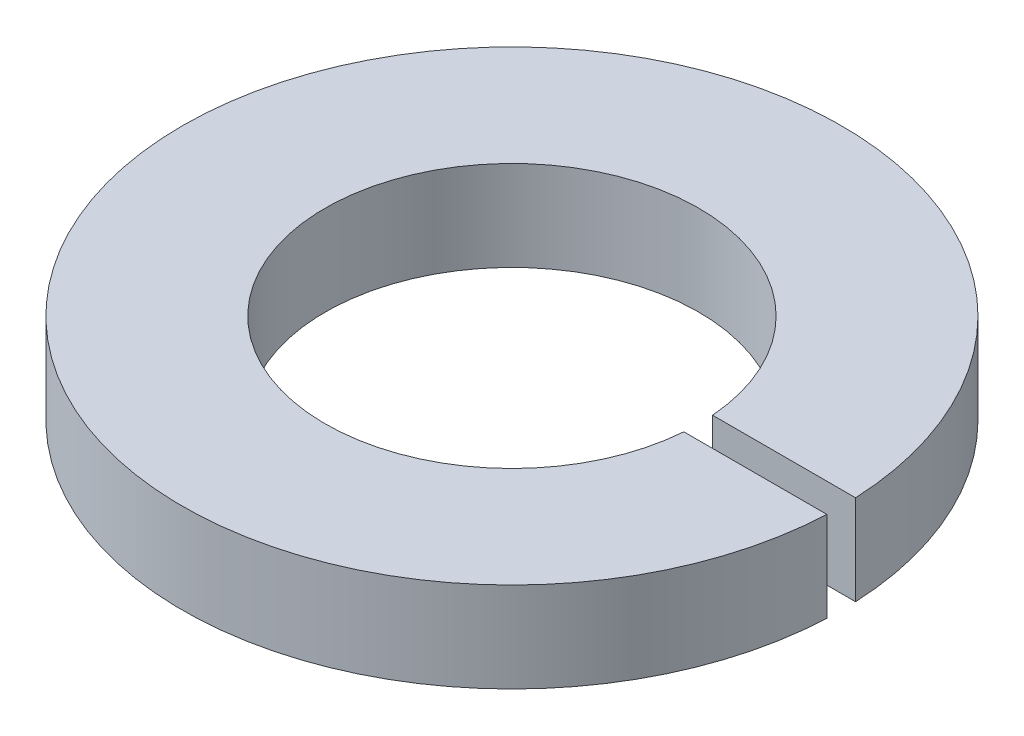
ISO-10303-21;
HEADER;
FILE_DESCRIPTION(('STEP AP214'),'2;1');
FILE_NAME('part.step','',(''),(''),'','','');
FILE_SCHEMA(('AUTOMOTIVE_DESIGN { 1 0 10303 214 1 1 1 1 }'));
ENDSEC;
DATA;
#1=APPLICATION_CONTEXT('core data for automotive mechanical design processes');
#2=APPLICATION_PROTOCOL_DEFINITION('international standard','automotive_design',2000,#1);
#3=PRODUCT_CONTEXT('',#1,'mechanical');
#4=PRODUCT('Part','Part','',(#3));
#5=PRODUCT_RELATED_PRODUCT_CATEGORY('part','',(#4));
#6=PRODUCT_DEFINITION_FORMATION('','',#4);
#7=PRODUCT_DEFINITION_CONTEXT('part definition',#1,'design');
#8=PRODUCT_DEFINITION('design','',#6,#7);
#9=PRODUCT_DEFINITION_SHAPE('','',#8);
#10=(LENGTH_UNIT() NAMED_UNIT(*) SI_UNIT(.MILLI.,.METRE.));
#11=(NAMED_UNIT(*) PLANE_ANGLE_UNIT() SI_UNIT($,.RADIAN.));
#12=(NAMED_UNIT(*) SI_UNIT($,.STERADIAN.) SOLID_ANGLE_UNIT());
#13=UNCERTAINTY_MEASURE_WITH_UNIT(LENGTH_MEASURE(1.E-05),#10,'distance_accuracy_value','');
#14=(GEOMETRIC_REPRESENTATION_CONTEXT(3) GLOBAL_UNCERTAINTY_ASSIGNED_CONTEXT((#13)) GLOBAL_UNIT_ASSIGNED_CONTEXT((#10,
#11,#12)) REPRESENTATION_CONTEXT('',''));
#15=CARTESIAN_POINT('',(0.,0.,0.));
#16=DIRECTION('',(0.,0.,1.));
#17=DIRECTION('',(1.,0.,0.));
#18=AXIS2_PLACEMENT_3D('',#15,#16,#17);
#19=CARTESIAN_POINT('',(0.,2.3876,0.));
#20=DIRECTION('',(0.,1.,0.));
#21=DIRECTION('',(0.,0.,1.));
#22=AXIS2_PLACEMENT_3D('',#19,#20,#21);
#23=PLANE('',#22);
#24=CARTESIAN_POINT('',(0.,2.3876,0.));
#25=DIRECTION('',(0.,1.,0.));
#26=DIRECTION('',(0.,0.,1.));
#27=AXIS2_PLACEMENT_3D('',#24,#25,#26);
#28=CIRCLE('',#27,8.7376);
#29=CARTESIAN_POINT('',(8.72928936168346,2.3876,-0.380999999999999));
#30=VERTEX_POINT('',#29);
#31=CARTESIAN_POINT('',(8.72928936168346,2.3876,0.381000000000001));
#32=VERTEX_POINT('',#31);
#33=EDGE_CURVE('E91',#30,#32,#28,.T.);
#34=ORIENTED_EDGE('',*,*,#33,.T.);
#35=DIRECTION('',(-1.,0.,0.));
#36=VECTOR('',#35,1.);
#37=CARTESIAN_POINT('',(8.72928936168346,2.3876,0.381000000000001));
#38=LINE('',#37,#36);
#39=CARTESIAN_POINT('',(4.93832441218679,2.3876,0.381000000000001));
#40=VERTEX_POINT('',#39);
#41=EDGE_CURVE('E94',#32,#40,#38,.T.);
#42=ORIENTED_EDGE('',*,*,#41,.T.);
#43=CARTESIAN_POINT('',(0.,2.3876,0.));
#44=DIRECTION('',(0.,1.,0.));
#45=DIRECTION('',(0.,0.,1.));
#46=AXIS2_PLACEMENT_3D('',#43,#44,#45);
#47=CIRCLE('',#46,4.953);
#48=CARTESIAN_POINT('',(4.93832441218679,2.3876,-0.381));
#49=VERTEX_POINT('',#48);
#50=EDGE_CURVE('E93',#49,#40,#47,.T.);
#51=ORIENTED_EDGE('',*,*,#50,.F.);
#52=DIRECTION('',(-1.,0.,0.));
#53=VECTOR('',#52,1.);
#54=CARTESIAN_POINT('',(8.72928936168346,2.3876,-0.380999999999999));
#55=LINE('',#54,#53);
#56=EDGE_CURVE('E60',#30,#49,#55,.T.);
#57=ORIENTED_EDGE('',*,*,#56,.F.);
#58=EDGE_LOOP('',(#34,#42,#51,#57));
#59=FACE_BOUND('',#58,.T.);
#60=ADVANCED_FACE('F38',(#59),#23,.T.);
#61=CARTESIAN_POINT('',(0.,0.,0.));
#62=DIRECTION('',(0.,1.,0.));
#63=DIRECTION('',(0.,0.,1.));
#64=AXIS2_PLACEMENT_3D('',#61,#62,#63);
#65=PLANE('',#64);
#66=DIRECTION('',(-1.,0.,0.));
#67=VECTOR('',#66,1.);
#68=CARTESIAN_POINT('',(8.72928936168346,0.,0.381000000000001));
#69=LINE('',#68,#67);
#70=CARTESIAN_POINT('',(8.72928936168346,0.,0.381000000000001));
#71=VERTEX_POINT('',#70);
#72=CARTESIAN_POINT('',(4.93832441218679,0.,0.381000000000001));
#73=VERTEX_POINT('',#72);
#74=EDGE_CURVE('E53',#71,#73,#69,.T.);
#75=ORIENTED_EDGE('',*,*,#74,.F.);
#76=CARTESIAN_POINT('',(0.,0.,0.));
#77=DIRECTION('',(0.,1.,0.));
#78=DIRECTION('',(0.,0.,1.));
#79=AXIS2_PLACEMENT_3D('',#76,#77,#78);
#80=CIRCLE('',#79,8.7376);
#81=CARTESIAN_POINT('',(8.72928936168346,0.,-0.380999999999999));
#82=VERTEX_POINT('',#81);
#83=EDGE_CURVE('E97',#82,#71,#80,.T.);
#84=ORIENTED_EDGE('',*,*,#83,.F.);
#85=DIRECTION('',(-1.,0.,0.));
#86=VECTOR('',#85,1.);
#87=CARTESIAN_POINT('',(8.72928936168346,0.,-0.380999999999999));
#88=LINE('',#87,#86);
#89=CARTESIAN_POINT('',(4.93832441218679,0.,-0.381));
#90=VERTEX_POINT('',#89);
#91=EDGE_CURVE('E79',#82,#90,#88,.T.);
#92=ORIENTED_EDGE('',*,*,#91,.T.);
#93=CARTESIAN_POINT('',(0.,0.,0.));
#94=DIRECTION('',(0.,1.,0.));
#95=DIRECTION('',(0.,0.,1.));
#96=AXIS2_PLACEMENT_3D('',#93,#94,#95);
#97=CIRCLE('',#96,4.953);
#98=EDGE_CURVE('E84',#90,#73,#97,.T.);
#99=ORIENTED_EDGE('',*,*,#98,.T.);
#100=EDGE_LOOP('',(#75,#84,#92,#99));
#101=FACE_BOUND('',#100,.T.);
#102=ADVANCED_FACE('F111',(#101),#65,.F.);
#103=CARTESIAN_POINT('',(0.,2.3876,0.));
#104=DIRECTION('',(0.,-1.,0.));
#105=DIRECTION('',(0.,0.,-1.));
#106=AXIS2_PLACEMENT_3D('',#103,#104,#105);
#107=CYLINDRICAL_SURFACE('',#106,8.7376);
#108=DIRECTION('',(0.,1.,0.));
#109=VECTOR('',#108,1.);
#110=CARTESIAN_POINT('',(8.72928936168346,0.,0.381000000000001));
#111=LINE('',#110,#109);
#112=EDGE_CURVE('E85',#71,#32,#111,.T.);
#113=ORIENTED_EDGE('',*,*,#112,.T.);
#114=ORIENTED_EDGE('',*,*,#33,.F.);
#115=DIRECTION('',(0.,1.,0.));
#116=VECTOR('',#115,1.);
#117=CARTESIAN_POINT('',(8.72928936168346,0.,-0.380999999999999));
#118=LINE('',#117,#116);
#119=EDGE_CURVE('E76',#82,#30,#118,.T.);
#120=ORIENTED_EDGE('',*,*,#119,.F.);
#121=ORIENTED_EDGE('',*,*,#83,.T.);
#122=EDGE_LOOP('',(#113,#114,#120,#121));
#123=FACE_BOUND('',#122,.T.);
#124=ADVANCED_FACE('F40',(#123),#107,.T.);
#125=CARTESIAN_POINT('',(0.,2.3876,0.));
#126=DIRECTION('',(0.,-1.,0.));
#127=DIRECTION('',(0.,0.,-1.));
#128=AXIS2_PLACEMENT_3D('',#125,#126,#127);
#129=CYLINDRICAL_SURFACE('',#128,4.953);
#130=ORIENTED_EDGE('',*,*,#50,.T.);
#131=DIRECTION('',(0.,-1.,0.));
#132=VECTOR('',#131,1.);
#133=CARTESIAN_POINT('',(4.93832441218679,2.3876,0.381000000000001));
#134=LINE('',#133,#132);
#135=EDGE_CURVE('E11',#40,#73,#134,.T.);
#136=ORIENTED_EDGE('',*,*,#135,.T.);
#137=ORIENTED_EDGE('',*,*,#98,.F.);
#138=DIRECTION('',(0.,-1.,0.));
#139=VECTOR('',#138,1.);
#140=CARTESIAN_POINT('',(4.93832441218679,2.3876,-0.381));
#141=LINE('',#140,#139);
#142=EDGE_CURVE('E46',#49,#90,#141,.T.);
#143=ORIENTED_EDGE('',*,*,#142,.F.);
#144=EDGE_LOOP('',(#130,#136,#137,#143));
#145=FACE_BOUND('',#144,.T.);
#146=ADVANCED_FACE('F108',(#145),#129,.F.);
#147=CARTESIAN_POINT('',(8.72928936168346,0.,-0.380999999999999));
#148=DIRECTION('',(0.,0.,-1.));
#149=DIRECTION('',(-1.,0.,0.));
#150=AXIS2_PLACEMENT_3D('',#147,#148,#149);
#151=PLANE('',#150);
#152=ORIENTED_EDGE('',*,*,#142,.T.);
#153=ORIENTED_EDGE('',*,*,#91,.F.);
#154=ORIENTED_EDGE('',*,*,#119,.T.);
#155=ORIENTED_EDGE('',*,*,#56,.T.);
#156=EDGE_LOOP('',(#152,#153,#154,#155));
#157=FACE_BOUND('',#156,.T.);
#158=ADVANCED_FACE('F77',(#157),#151,.F.);
#159=CARTESIAN_POINT('',(8.72928936168346,0.,0.381000000000001));
#160=DIRECTION('',(0.,0.,-1.));
#161=DIRECTION('',(-1.,0.,0.));
#162=AXIS2_PLACEMENT_3D('',#159,#160,#161);
#163=PLANE('',#162);
#164=ORIENTED_EDGE('',*,*,#41,.F.);
#165=ORIENTED_EDGE('',*,*,#112,.F.);
#166=ORIENTED_EDGE('',*,*,#74,.T.);
#167=ORIENTED_EDGE('',*,*,#135,.F.);
#168=EDGE_LOOP('',(#164,#165,#166,#167));
#169=FACE_BOUND('',#168,.T.);
#170=ADVANCED_FACE('F121',(#169),#163,.T.);
#171=CLOSED_SHELL('',(#60,#102,#124,#146,#158,#170));
#172=MANIFOLD_SOLID_BREP('B2',#171);
#173=ADVANCED_BREP_SHAPE_REPRESENTATION('',(#18,#172),#14);
#174=SHAPE_DEFINITION_REPRESENTATION(#9,#173);
ENDSEC;
END-ISO-10303-21;
